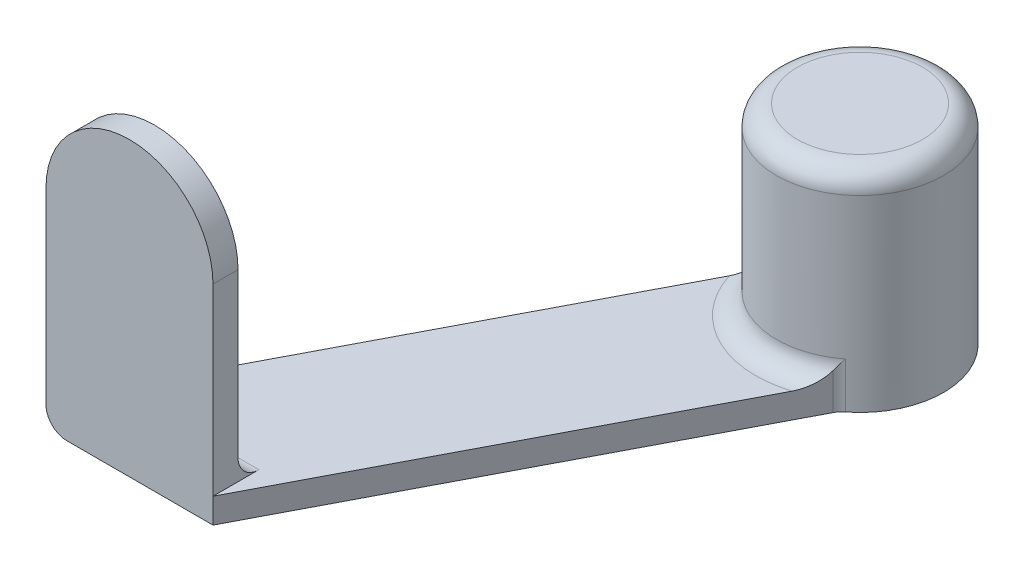
ISO-10303-21;
HEADER;
FILE_DESCRIPTION(('STEP AP214'),'2;1');
FILE_NAME('part.step','',(''),(''),'','','');
FILE_SCHEMA(('AUTOMOTIVE_DESIGN { 1 0 10303 214 1 1 1 1 }'));
ENDSEC;
DATA;
#1=APPLICATION_CONTEXT('core data for automotive mechanical design processes');
#2=APPLICATION_PROTOCOL_DEFINITION('international standard','automotive_design',2000,#1);
#3=PRODUCT_CONTEXT('',#1,'mechanical');
#4=PRODUCT('Part','Part','',(#3));
#5=PRODUCT_RELATED_PRODUCT_CATEGORY('part','',(#4));
#6=PRODUCT_DEFINITION_FORMATION('','',#4);
#7=PRODUCT_DEFINITION_CONTEXT('part definition',#1,'design');
#8=PRODUCT_DEFINITION('design','',#6,#7);
#9=PRODUCT_DEFINITION_SHAPE('','',#8);
#10=(LENGTH_UNIT() NAMED_UNIT(*) SI_UNIT(.MILLI.,.METRE.));
#11=(NAMED_UNIT(*) PLANE_ANGLE_UNIT() SI_UNIT($,.RADIAN.));
#12=(NAMED_UNIT(*) SI_UNIT($,.STERADIAN.) SOLID_ANGLE_UNIT());
#13=UNCERTAINTY_MEASURE_WITH_UNIT(LENGTH_MEASURE(1.E-05),#10,'distance_accuracy_value','');
#14=(GEOMETRIC_REPRESENTATION_CONTEXT(3) GLOBAL_UNCERTAINTY_ASSIGNED_CONTEXT((#13)) GLOBAL_UNIT_ASSIGNED_CONTEXT((#10,
#11,#12)) REPRESENTATION_CONTEXT('',''));
#15=CARTESIAN_POINT('',(0.,0.,0.));
#16=DIRECTION('',(0.,0.,1.));
#17=DIRECTION('',(1.,0.,0.));
#18=AXIS2_PLACEMENT_3D('',#15,#16,#17);
#19=CARTESIAN_POINT('',(459.323706874525,0.,110.));
#20=DIRECTION('',(0.,-1.,0.));
#21=DIRECTION('',(0.,0.,-1.));
#22=AXIS2_PLACEMENT_3D('',#19,#20,#21);
#23=PLANE('',#22);
#24=CARTESIAN_POINT('',(60.,0.,0.));
#25=DIRECTION('',(0.,-1.,0.));
#26=DIRECTION('',(0.,0.,-1.));
#27=AXIS2_PLACEMENT_3D('',#24,#25,#26);
#28=CIRCLE('',#27,15.);
#29=CARTESIAN_POINT('',(60.,0.,-15.0000000000001));
#30=VERTEX_POINT('',#29);
#31=EDGE_CURVE('E199',#30,#30,#28,.F.);
#32=ORIENTED_EDGE('',*,*,#31,.T.);
#33=EDGE_LOOP('',(#32));
#34=FACE_BOUND('',#33,.T.);
#35=ADVANCED_FACE('F37',(#34),#23,.F.);
#36=CARTESIAN_POINT('',(60.,-5.,0.));
#37=DIRECTION('',(0.,-1.,0.));
#38=DIRECTION('',(0.,0.,-1.));
#39=AXIS2_PLACEMENT_3D('',#36,#37,#38);
#40=TOROIDAL_SURFACE('',#39,15.,5.);
#41=ORIENTED_EDGE('',*,*,#31,.F.);
#42=EDGE_LOOP('',(#41));
#43=FACE_BOUND('',#42,.T.);
#44=CARTESIAN_POINT('',(60.,-5.,0.));
#45=DIRECTION('',(0.,-1.,0.));
#46=DIRECTION('',(0.,0.,-1.));
#47=AXIS2_PLACEMENT_3D('',#44,#45,#46);
#48=CIRCLE('',#47,20.);
#49=CARTESIAN_POINT('',(60.,-5.,-20.0000000000001));
#50=VERTEX_POINT('',#49);
#51=EDGE_CURVE('E196',#50,#50,#48,.T.);
#52=ORIENTED_EDGE('',*,*,#51,.F.);
#53=EDGE_LOOP('',(#52));
#54=FACE_BOUND('',#53,.T.);
#55=ADVANCED_FACE('F266',(#43,#54),#40,.T.);
#56=CARTESIAN_POINT('',(60.,-39.,0.));
#57=DIRECTION('',(0.,-1.,0.));
#58=DIRECTION('',(0.,0.,-1.));
#59=AXIS2_PLACEMENT_3D('',#56,#57,#58);
#60=TOROIDAL_SURFACE('',#59,25.,5.);
#61=CARTESIAN_POINT('',(70.9075226790226,-41.2977810602774,17.4272481985399));
#62=CARTESIAN_POINT('',(70.9509078704048,-41.2060498439026,17.3441072624428));
#63=CARTESIAN_POINT('',(70.9962333162912,-41.1134994802739,17.2629221337946));
#64=CARTESIAN_POINT('',(71.0905444477898,-40.9270140833481,17.1043907751823));
#65=CARTESIAN_POINT('',(71.1395295317539,-40.8330792796838,17.0270439176671));
#66=CARTESIAN_POINT('',(71.2916425842111,-40.5495771233536,16.8006470842951));
#67=CARTESIAN_POINT('',(71.3999488380699,-40.3582689118968,16.6572020545719));
#68=CARTESIAN_POINT('',(71.6278515517499,-39.9748426216229,16.3863276333788));
#69=CARTESIAN_POINT('',(71.7473197642914,-39.7827533449282,16.2587480472092));
#70=CARTESIAN_POINT('',(71.9976842882147,-39.3972707643174,16.0176987367564));
#71=CARTESIAN_POINT('',(72.1285754388683,-39.2038780853297,15.904222696281));
#72=CARTESIAN_POINT('',(72.267396396857,-39.007027263067,15.7959217472598));
#73=CARTESIAN_POINT('',(72.2698760628762,-39.0035136201135,15.7939909923101));
#74=CARTESIAN_POINT('',(72.2723575278799,-39.,15.792062585612));
#75=B_SPLINE_CURVE_WITH_KNOTS('',3,(#61,#62,#63,#64,#65,#66,#67,#68,#69,#70,#71,#72,#73,#74),
.UNSPECIFIED.,.F.,.F.,(4,2,2,2,2,2,4),(0.,0.39347776569895,0.786890985021447,1.57353344680736,
2.35204627452866,3.1302091837241,3.14435132214105),.UNSPECIFIED.);
#76=CARTESIAN_POINT('',(70.9075226790226,-41.2977810602774,17.4272481985399));
#77=VERTEX_POINT('',#76);
#78=CARTESIAN_POINT('',(72.2723575278799,-39.,15.792062585612));
#79=VERTEX_POINT('',#78);
#80=EDGE_CURVE('E42',#77,#79,#75,.T.);
#81=ORIENTED_EDGE('',*,*,#80,.T.);
#82=CARTESIAN_POINT('',(60.,-39.,0.));
#83=DIRECTION('',(0.,-1.,0.));
#84=DIRECTION('',(0.,0.,-1.));
#85=AXIS2_PLACEMENT_3D('',#82,#83,#84);
#86=CIRCLE('',#85,20.);
#87=CARTESIAN_POINT('',(40.0266326961491,-39.,-1.03179384833457));
#88=VERTEX_POINT('',#87);
#89=EDGE_CURVE('E190',#88,#79,#86,.F.);
#90=ORIENTED_EDGE('',*,*,#89,.F.);
#91=CARTESIAN_POINT('',(39.4662151010137,-41.2977810602773,1.02308772305691));
#92=CARTESIAN_POINT('',(39.5095887979579,-41.2060498439027,0.939940789861573));
#93=CARTESIAN_POINT('',(39.5502483735114,-41.1134994802739,0.856321294083294));
#94=CARTESIAN_POINT('',(39.6263249326898,-40.9270140833481,0.688276245564992));
#95=CARTESIAN_POINT('',(39.661742775219,-40.8330792796838,0.60385082730128));
#96=CARTESIAN_POINT('',(39.7604166635182,-40.5495771233538,0.349572690889744));
#97=CARTESIAN_POINT('',(39.8161131697168,-40.358268911898,0.1786790971685));
#98=CARTESIAN_POINT('',(39.9079112911606,-39.9748426216213,-0.163206415623165));
#99=CARTESIAN_POINT('',(39.9442094631323,-39.7827533449229,-0.33417906643354));
#100=CARTESIAN_POINT('',(39.9986951654503,-39.3972707643223,-0.677426022952912));
#101=CARTESIAN_POINT('',(40.0168908286622,-39.2038780853485,-0.849699709065943));
#102=CARTESIAN_POINT('',(40.026305472099,-39.0070272630677,-1.02551699609304));
#103=CARTESIAN_POINT('',(40.0264705617198,-39.0035136201138,-1.02865535611975));
#104=CARTESIAN_POINT('',(40.0266326961491,-39.,-1.03179384833457));
#105=B_SPLINE_CURVE_WITH_KNOTS('',3,(#91,#92,#93,#94,#95,#96,#97,#98,#99,#100,#101,#102,#103,
#104),.UNSPECIFIED.,.F.,.F.,(4,2,2,2,2,2,4),(0.,0.393477765698781,0.786890985021145,
1.57353344680769,2.35204627452887,3.13020918372401,3.14435132214095),.UNSPECIFIED.);
#106=CARTESIAN_POINT('',(39.4662151010137,-41.2977810602773,1.02308772305691));
#107=VERTEX_POINT('',#106);
#108=EDGE_CURVE('E275',#107,#88,#105,.T.);
#109=ORIENTED_EDGE('',*,*,#108,.F.);
#110=CARTESIAN_POINT('',(36.127325058713,-44.,7.42262697079987));
#111=CARTESIAN_POINT('',(36.1983313776552,-43.9999956408551,7.28653152616076));
#112=CARTESIAN_POINT('',(36.2693244817584,-43.996487374847,7.15046140996296));
#113=CARTESIAN_POINT('',(36.4111585744376,-43.9827129862363,6.87861273232785));
#114=CARTESIAN_POINT('',(36.4819995875669,-43.9724480520668,6.74283412382997));
#115=CARTESIAN_POINT('',(36.694056607901,-43.9319077475049,6.33639150152288));
#116=CARTESIAN_POINT('',(36.8348941114184,-43.8918862522785,6.0664529531146));
#117=CARTESIAN_POINT('',(37.1162762485836,-43.7869081443704,5.52713719021467));
#118=CARTESIAN_POINT('',(37.2567969807931,-43.7216573796766,5.2578057868131));
#119=CARTESIAN_POINT('',(37.5350443801921,-43.5675155773244,4.72449827129834));
#120=CARTESIAN_POINT('',(37.6727709721124,-43.4786239037293,4.46052230345118));
#121=CARTESIAN_POINT('',(37.924554665456,-43.2926851196398,3.97793689120913));
#122=CARTESIAN_POINT('',(38.0391092301934,-43.1987695546417,3.75837397546259));
#123=CARTESIAN_POINT('',(38.2649825179203,-42.9942564296783,3.32545017398592));
#124=CARTESIAN_POINT('',(38.3763016898555,-42.8836611975048,3.1120884277769));
#125=CARTESIAN_POINT('',(38.5943299254657,-42.6459459311547,2.69420097619053));
#126=CARTESIAN_POINT('',(38.701061312825,-42.5189218938219,2.48963248375193));
#127=CARTESIAN_POINT('',(38.9094187027398,-42.2467784866218,2.09028081974862));
#128=CARTESIAN_POINT('',(39.0110486109277,-42.1016732653124,1.8954901623884));
#129=CARTESIAN_POINT('',(39.1720039777722,-41.8472664837278,1.58699237593648));
#130=CARTESIAN_POINT('',(39.2333531127909,-41.7439583114357,1.46940653381727));
#131=CARTESIAN_POINT('',(39.3227797748614,-41.5820942752567,1.29800543151553));
#132=CARTESIAN_POINT('',(39.3521781828871,-41.5269426510822,1.24165848279962));
#133=CARTESIAN_POINT('',(39.4099778945258,-41.414211744272,1.13087570215881));
#134=CARTESIAN_POINT('',(39.438378869872,-41.3566316758776,1.07644049941189));
#135=CARTESIAN_POINT('',(39.4662151010137,-41.2977810602773,1.0230877230569));
#136=B_SPLINE_CURVE_WITH_KNOTS('',3,(#110,#111,#112,#113,#114,#115,#116,#117,#118,#119,#120,
#121,#122,#123,#124,#125,#126,#127,#128,#129,#130,#131,#132,#133,#134,#135),.UNSPECIFIED.,.F.,
.F.,(4,2,2,2,2,2,2,2,2,2,2,2,4),(0.,0.46042520380747,0.920769444870729,1.84089225436548,
2.77208316234223,3.70329912174847,4.49730518465676,5.2912005395171,6.08065054135098,
6.8694866314445,7.37345852418002,7.62584653107154,7.87831683790805),.UNSPECIFIED.);
#137=CARTESIAN_POINT('',(36.127325058713,-44.,7.42262697079986));
#138=VERTEX_POINT('',#137);
#139=EDGE_CURVE('E11',#138,#107,#136,.T.);
#140=ORIENTED_EDGE('',*,*,#139,.F.);
#141=CARTESIAN_POINT('',(60.,-44.,0.));
#142=DIRECTION('',(0.,-1.,0.));
#143=DIRECTION('',(0.,0.,-1.));
#144=AXIS2_PLACEMENT_3D('',#141,#142,#143);
#145=CIRCLE('',#144,25.);
#146=CARTESIAN_POINT('',(67.568632636722,-44.,23.8267874462828));
#147=VERTEX_POINT('',#146);
#148=EDGE_CURVE('E205',#147,#138,#145,.T.);
#149=ORIENTED_EDGE('',*,*,#148,.F.);
#150=CARTESIAN_POINT('',(70.9075226790226,-41.2977810602774,17.4272481985399));
#151=CARTESIAN_POINT('',(70.8723876986568,-41.372047631136,17.494590244241));
#152=CARTESIAN_POINT('',(70.8363596565238,-41.4442990005166,17.5636439916626));
#153=CARTESIAN_POINT('',(70.762768017994,-41.5849808420244,17.7046946321781));
#154=CARTESIAN_POINT('',(70.7252051277247,-41.653413037682,17.7766901718608));
#155=CARTESIAN_POINT('',(70.6488384664411,-41.7865997555289,17.9230596059878));
#156=CARTESIAN_POINT('',(70.6100373295972,-41.8513613646149,17.9974284516053));
#157=CARTESIAN_POINT('',(70.5312896443772,-41.977555076726,18.1483615149437));
#158=CARTESIAN_POINT('',(70.4913429425247,-42.0389867304058,18.2249260268275));
#159=CARTESIAN_POINT('',(70.3700246804952,-42.2185094382374,18.4574526957174));
#160=CARTESIAN_POINT('',(70.2871471986759,-42.331876026524,18.6163012025377));
#161=CARTESIAN_POINT('',(70.1181808099681,-42.5470105977815,18.940153447561));
#162=CARTESIAN_POINT('',(70.0320894630321,-42.6487695200325,19.1051618625217));
#163=CARTESIAN_POINT('',(69.8097677784512,-42.8935800018219,19.5312784246352));
#164=CARTESIAN_POINT('',(69.6717268227997,-43.029000623418,19.7958569229671));
#165=CARTESIAN_POINT('',(69.3908877015465,-43.2744207909353,20.3341319053691));
#166=CARTESIAN_POINT('',(69.2480882739406,-43.3844135306858,20.6078308082805));
#167=CARTESIAN_POINT('',(68.9586762753818,-43.5787682633448,21.1625371388514));
#168=CARTESIAN_POINT('',(68.8120607591067,-43.6631097805981,21.4435502117121));
#169=CARTESIAN_POINT('',(68.5161474067954,-43.8049111534692,22.0107174703087));
#170=CARTESIAN_POINT('',(68.3668513082687,-43.8623878125707,22.2968683258183));
#171=CARTESIAN_POINT('',(68.1091168218845,-43.9365322706474,22.7908594247213));
#172=CARTESIAN_POINT('',(68.0011009255267,-43.9601510504176,22.9978898927404));
#173=CARTESIAN_POINT('',(67.784945511072,-43.9918477988025,23.4121877704453));
#174=CARTESIAN_POINT('',(67.6768075854373,-43.9999769458228,23.6194521279119));
#175=CARTESIAN_POINT('',(67.568632636722,-44.,23.8267874462828));
#176=B_SPLINE_CURVE_WITH_KNOTS('',3,(#150,#151,#152,#153,#154,#155,#156,#157,#158,#159,#160,
#161,#162,#163,#164,#165,#166,#167,#168,#169,#170,#171,#172,#173,#174,#175),.UNSPECIFIED.,.F.,
.F.,(4,2,2,2,2,2,2,2,2,2,2,2,4),(0.,0.318613584331942,0.637082201181579,0.95491338693593,
1.27278735471745,1.90830568841894,2.54431674906336,3.52613455500781,4.50821485637313,
5.49107704160757,6.47332363888854,7.17696009410412,7.87826764573219),.UNSPECIFIED.);
#177=EDGE_CURVE('E50',#77,#147,#176,.T.);
#178=ORIENTED_EDGE('',*,*,#177,.F.);
#179=EDGE_LOOP('',(#81,#90,#109,#140,#149,#178));
#180=FACE_BOUND('',#179,.T.);
#181=ADVANCED_FACE('F228',(#180),#60,.F.);
#182=CARTESIAN_POINT('',(75.3404469098499,56.5685424949237,19.740078232015));
#183=DIRECTION('',(0.,-1.,0.));
#184=DIRECTION('',(0.,0.,-1.));
#185=AXIS2_PLACEMENT_3D('',#182,#183,#184);
#186=CYLINDRICAL_SURFACE('',#185,5.);
#187=CARTESIAN_POINT('',(75.3404469098499,-50.,19.740078232015));
#188=DIRECTION('',(0.,-1.,0.));
#189=DIRECTION('',(0.,0.,-1.));
#190=AXIS2_PLACEMENT_3D('',#187,#188,#189);
#191=CIRCLE('',#190,5.);
#192=CARTESIAN_POINT('',(72.2723575278799,-50.,15.792062585612));
#193=VERTEX_POINT('',#192);
#194=CARTESIAN_POINT('',(70.9075226790226,-50.,17.4272481985399));
#195=VERTEX_POINT('',#194);
#196=EDGE_CURVE('E218',#193,#195,#191,.F.);
#197=ORIENTED_EDGE('',*,*,#196,.F.);
#198=DIRECTION('',(0.,-1.,0.));
#199=VECTOR('',#198,1.);
#200=CARTESIAN_POINT('',(72.2723575278799,56.5685424949237,15.792062585612));
#201=LINE('',#200,#199);
#202=EDGE_CURVE('E192',#79,#193,#201,.T.);
#203=ORIENTED_EDGE('',*,*,#202,.F.);
#204=ORIENTED_EDGE('',*,*,#80,.F.);
#205=DIRECTION('',(0.,-1.,0.));
#206=VECTOR('',#205,1.);
#207=CARTESIAN_POINT('',(70.9075226790226,-44.,17.4272481985399));
#208=LINE('',#207,#206);
#209=EDGE_CURVE('E58',#195,#77,#208,.F.);
#210=ORIENTED_EDGE('',*,*,#209,.F.);
#211=EDGE_LOOP('',(#197,#203,#204,#210));
#212=FACE_BOUND('',#211,.T.);
#213=ADVANCED_FACE('F39',(#212),#186,.F.);
#214=CARTESIAN_POINT('',(60.,56.5685424949237,0.));
#215=DIRECTION('',(0.,-1.,0.));
#216=DIRECTION('',(0.,0.,-1.));
#217=AXIS2_PLACEMENT_3D('',#214,#215,#216);
#218=CYLINDRICAL_SURFACE('',#217,20.);
#219=ORIENTED_EDGE('',*,*,#51,.T.);
#220=EDGE_LOOP('',(#219));
#221=FACE_BOUND('',#220,.T.);
#222=CARTESIAN_POINT('',(60.,-50.,0.));
#223=DIRECTION('',(0.,-1.,0.));
#224=DIRECTION('',(0.,0.,-1.));
#225=AXIS2_PLACEMENT_3D('',#222,#223,#224);
#226=CIRCLE('',#225,20.);
#227=CARTESIAN_POINT('',(40.0266326961491,-50.,-1.03179384833457));
#228=VERTEX_POINT('',#227);
#229=EDGE_CURVE('E282',#193,#228,#226,.F.);
#230=ORIENTED_EDGE('',*,*,#229,.T.);
#231=DIRECTION('',(0.,-1.,0.));
#232=VECTOR('',#231,1.);
#233=CARTESIAN_POINT('',(40.0266326961491,56.5685424949237,-1.03179384833457));
#234=LINE('',#233,#232);
#235=EDGE_CURVE('E194',#228,#88,#234,.F.);
#236=ORIENTED_EDGE('',*,*,#235,.T.);
#237=ORIENTED_EDGE('',*,*,#89,.T.);
#238=ORIENTED_EDGE('',*,*,#202,.T.);
#239=EDGE_LOOP('',(#230,#236,#237,#238));
#240=FACE_BOUND('',#239,.T.);
#241=ADVANCED_FACE('F274',(#221,#240),#218,.T.);
#242=CARTESIAN_POINT('',(35.0332908701864,56.5685424949237,-1.28974231041819));
#243=DIRECTION('',(0.,-1.,0.));
#244=DIRECTION('',(0.,0.,-1.));
#245=AXIS2_PLACEMENT_3D('',#242,#243,#244);
#246=CYLINDRICAL_SURFACE('',#245,5.);
#247=ORIENTED_EDGE('',*,*,#108,.T.);
#248=ORIENTED_EDGE('',*,*,#235,.F.);
#249=CARTESIAN_POINT('',(35.0332908701864,-50.,-1.28974231041819));
#250=DIRECTION('',(0.,-1.,0.));
#251=DIRECTION('',(0.,0.,-1.));
#252=AXIS2_PLACEMENT_3D('',#249,#250,#251);
#253=CIRCLE('',#252,5.);
#254=CARTESIAN_POINT('',(39.4662151010137,-50.,1.02308772305688));
#255=VERTEX_POINT('',#254);
#256=EDGE_CURVE('E216',#255,#228,#253,.F.);
#257=ORIENTED_EDGE('',*,*,#256,.F.);
#258=DIRECTION('',(0.,-1.,0.));
#259=VECTOR('',#258,1.);
#260=CARTESIAN_POINT('',(39.4662151010137,-44.,1.02308772305691));
#261=LINE('',#260,#259);
#262=EDGE_CURVE('E66',#107,#255,#261,.T.);
#263=ORIENTED_EDGE('',*,*,#262,.F.);
#264=EDGE_LOOP('',(#247,#248,#257,#263));
#265=FACE_BOUND('',#264,.T.);
#266=ADVANCED_FACE('F243',(#265),#246,.F.);
#267=CARTESIAN_POINT('',(-20.,-44.,115.));
#268=DIRECTION('',(-0.886584846165455,0.,-0.46256600669502));
#269=DIRECTION('',(-0.46256600669502,0.,0.886584846165455));
#270=AXIS2_PLACEMENT_3D('',#267,#268,#269);
#271=PLANE('',#270);
#272=DIRECTION('',(0.46256600669502,0.,-0.886584846165455));
#273=VECTOR('',#272,1.);
#274=CARTESIAN_POINT('',(-20.,-44.,115.));
#275=LINE('',#274,#273);
#276=CARTESIAN_POINT('',(-14.2608695652174,-44.,104.));
#277=VERTEX_POINT('',#276);
#278=EDGE_CURVE('E295',#277,#138,#275,.T.);
#279=ORIENTED_EDGE('',*,*,#278,.T.);
#280=ORIENTED_EDGE('',*,*,#139,.T.);
#281=ORIENTED_EDGE('',*,*,#262,.T.);
#282=DIRECTION('',(0.46256600669502,0.,-0.886584846165455));
#283=VECTOR('',#282,1.);
#284=CARTESIAN_POINT('',(-20.,-50.,115.));
#285=LINE('',#284,#283);
#286=CARTESIAN_POINT('',(-15.,-50.,105.416666666667));
#287=VERTEX_POINT('',#286);
#288=EDGE_CURVE('E287',#287,#255,#285,.T.);
#289=ORIENTED_EDGE('',*,*,#288,.F.);
#290=CARTESIAN_POINT('',(-15.,-45.,105.416666666667));
#291=DIRECTION('',(-0.886584846165455,0.,-0.46256600669502));
#292=DIRECTION('',(-0.46256600669502,0.,0.886584846165455));
#293=AXIS2_PLACEMENT_3D('',#290,#291,#292);
#294=ELLIPSE('',#293,10.8092681425607,5.);
#295=CARTESIAN_POINT('',(-16.8695652173913,-49.6373188264255,109.));
#296=VERTEX_POINT('',#295);
#297=EDGE_CURVE('E183',#287,#296,#294,.T.);
#298=ORIENTED_EDGE('',*,*,#297,.T.);
#299=DIRECTION('',(0.,1.,0.));
#300=VECTOR('',#299,1.);
#301=CARTESIAN_POINT('',(-16.8695652173913,0.,109.));
#302=LINE('',#301,#300);
#303=CARTESIAN_POINT('',(-16.8695652173913,-39.,109.));
#304=VERTEX_POINT('',#303);
#305=EDGE_CURVE('E164',#296,#304,#302,.T.);
#306=ORIENTED_EDGE('',*,*,#305,.T.);
#307=CARTESIAN_POINT('',(-14.2608695652174,-39.,104.));
#308=DIRECTION('',(-0.886584846165455,0.,-0.46256600669502));
#309=DIRECTION('',(-0.46256600669502,0.,0.886584846165455));
#310=AXIS2_PLACEMENT_3D('',#307,#308,#309);
#311=ELLIPSE('',#310,5.63961816133602,5.);
#312=EDGE_CURVE('E212',#304,#277,#311,.F.);
#313=ORIENTED_EDGE('',*,*,#312,.T.);
#314=EDGE_LOOP('',(#279,#280,#281,#289,#298,#306,#313));
#315=FACE_BOUND('',#314,.T.);
#316=ADVANCED_FACE('F238',(#315),#271,.T.);
#317=CARTESIAN_POINT('',(0.,-39.,104.));
#318=DIRECTION('',(-1.,0.,0.));
#319=DIRECTION('',(0.,0.,1.));
#320=AXIS2_PLACEMENT_3D('',#317,#318,#319);
#321=CYLINDRICAL_SURFACE('',#320,5.);
#322=CARTESIAN_POINT('',(20.,-39.,104.));
#323=DIRECTION('',(-1.,0.,0.));
#324=DIRECTION('',(0.,0.,1.));
#325=AXIS2_PLACEMENT_3D('',#322,#323,#324);
#326=CIRCLE('',#325,5.);
#327=CARTESIAN_POINT('',(20.,-44.,104.));
#328=VERTEX_POINT('',#327);
#329=CARTESIAN_POINT('',(20.,-39.,109.));
#330=VERTEX_POINT('',#329);
#331=EDGE_CURVE('E214',#328,#330,#326,.T.);
#332=ORIENTED_EDGE('',*,*,#331,.F.);
#333=DIRECTION('',(-1.,0.,0.));
#334=VECTOR('',#333,1.);
#335=CARTESIAN_POINT('',(459.323706874525,-44.,104.));
#336=LINE('',#335,#334);
#337=EDGE_CURVE('E207',#277,#328,#336,.F.);
#338=ORIENTED_EDGE('',*,*,#337,.F.);
#339=ORIENTED_EDGE('',*,*,#312,.F.);
#340=DIRECTION('',(-1.,0.,0.));
#341=VECTOR('',#340,1.);
#342=CARTESIAN_POINT('',(0.,-39.,109.));
#343=LINE('',#342,#341);
#344=EDGE_CURVE('E202',#330,#304,#343,.T.);
#345=ORIENTED_EDGE('',*,*,#344,.F.);
#346=EDGE_LOOP('',(#332,#338,#339,#345));
#347=FACE_BOUND('',#346,.T.);
#348=ADVANCED_FACE('F242',(#347),#321,.F.);
#349=CARTESIAN_POINT('',(459.323706874525,-44.,110.));
#350=DIRECTION('',(0.,-1.,0.));
#351=DIRECTION('',(0.,0.,-1.));
#352=AXIS2_PLACEMENT_3D('',#349,#350,#351);
#353=PLANE('',#352);
#354=ORIENTED_EDGE('',*,*,#278,.F.);
#355=ORIENTED_EDGE('',*,*,#337,.T.);
#356=DIRECTION('',(0.,0.,1.));
#357=VECTOR('',#356,1.);
#358=CARTESIAN_POINT('',(20.,-44.,115.));
#359=LINE('',#358,#357);
#360=CARTESIAN_POINT('',(20.,-44.,115.));
#361=VERTEX_POINT('',#360);
#362=EDGE_CURVE('E176',#328,#361,#359,.T.);
#363=ORIENTED_EDGE('',*,*,#362,.T.);
#364=DIRECTION('',(-0.46256600669502,0.,0.886584846165455));
#365=VECTOR('',#364,1.);
#366=CARTESIAN_POINT('',(80.,-44.,0.));
#367=LINE('',#366,#365);
#368=EDGE_CURVE('E167',#147,#361,#367,.T.);
#369=ORIENTED_EDGE('',*,*,#368,.F.);
#370=ORIENTED_EDGE('',*,*,#148,.T.);
#371=EDGE_LOOP('',(#354,#355,#363,#369,#370));
#372=FACE_BOUND('',#371,.T.);
#373=ADVANCED_FACE('F236',(#372),#353,.F.);
#374=CARTESIAN_POINT('',(80.,-44.,0.));
#375=DIRECTION('',(0.886584846165455,0.,0.46256600669502));
#376=DIRECTION('',(0.46256600669502,0.,-0.886584846165455));
#377=AXIS2_PLACEMENT_3D('',#374,#375,#376);
#378=PLANE('',#377);
#379=DIRECTION('',(-0.46256600669502,0.,0.886584846165455));
#380=VECTOR('',#379,1.);
#381=CARTESIAN_POINT('',(80.,-50.,0.));
#382=LINE('',#381,#380);
#383=CARTESIAN_POINT('',(20.,-50.,115.));
#384=VERTEX_POINT('',#383);
#385=EDGE_CURVE('E292',#195,#384,#382,.T.);
#386=ORIENTED_EDGE('',*,*,#385,.F.);
#387=ORIENTED_EDGE('',*,*,#209,.T.);
#388=ORIENTED_EDGE('',*,*,#177,.T.);
#389=ORIENTED_EDGE('',*,*,#368,.T.);
#390=DIRECTION('',(0.,1.,0.));
#391=VECTOR('',#390,1.);
#392=CARTESIAN_POINT('',(20.,-50.,115.));
#393=LINE('',#392,#391);
#394=EDGE_CURVE('E171',#384,#361,#393,.T.);
#395=ORIENTED_EDGE('',*,*,#394,.F.);
#396=EDGE_LOOP('',(#386,#387,#388,#389,#395));
#397=FACE_BOUND('',#396,.T.);
#398=ADVANCED_FACE('F231',(#397),#378,.T.);
#399=CARTESIAN_POINT('',(459.323706874525,-50.,110.));
#400=DIRECTION('',(0.,-1.,0.));
#401=DIRECTION('',(0.,0.,-1.));
#402=AXIS2_PLACEMENT_3D('',#399,#400,#401);
#403=PLANE('',#402);
#404=DIRECTION('',(-1.,0.,0.));
#405=VECTOR('',#404,1.);
#406=CARTESIAN_POINT('',(-20.,-50.,115.));
#407=LINE('',#406,#405);
#408=CARTESIAN_POINT('',(-15.,-50.,115.));
#409=VERTEX_POINT('',#408);
#410=EDGE_CURVE('E158',#384,#409,#407,.T.);
#411=ORIENTED_EDGE('',*,*,#410,.T.);
#412=DIRECTION('',(0.,0.,-1.));
#413=VECTOR('',#412,1.);
#414=CARTESIAN_POINT('',(-15.,-50.,109.));
#415=LINE('',#414,#413);
#416=EDGE_CURVE('E180',#409,#287,#415,.T.);
#417=ORIENTED_EDGE('',*,*,#416,.T.);
#418=ORIENTED_EDGE('',*,*,#288,.T.);
#419=ORIENTED_EDGE('',*,*,#256,.T.);
#420=ORIENTED_EDGE('',*,*,#229,.F.);
#421=ORIENTED_EDGE('',*,*,#196,.T.);
#422=ORIENTED_EDGE('',*,*,#385,.T.);
#423=EDGE_LOOP('',(#411,#417,#418,#419,#420,#421,#422));
#424=FACE_BOUND('',#423,.T.);
#425=ADVANCED_FACE('F235',(#424),#403,.T.);
#426=CARTESIAN_POINT('',(-15.,-45.,110.));
#427=DIRECTION('',(0.,0.,1.));
#428=DIRECTION('',(1.,0.,0.));
#429=AXIS2_PLACEMENT_3D('',#426,#427,#428);
#430=CYLINDRICAL_SURFACE('',#429,5.);
#431=CARTESIAN_POINT('',(-15.,-45.,115.));
#432=DIRECTION('',(0.,0.,-1.));
#433=DIRECTION('',(-1.,0.,0.));
#434=AXIS2_PLACEMENT_3D('',#431,#432,#433);
#435=CIRCLE('',#434,5.);
#436=CARTESIAN_POINT('',(-20.,-45.,115.));
#437=VERTEX_POINT('',#436);
#438=EDGE_CURVE('E188',#437,#409,#435,.F.);
#439=ORIENTED_EDGE('',*,*,#438,.F.);
#440=DIRECTION('',(0.,0.,-1.));
#441=VECTOR('',#440,1.);
#442=CARTESIAN_POINT('',(-20.,-45.,115.));
#443=LINE('',#442,#441);
#444=CARTESIAN_POINT('',(-20.,-45.,109.));
#445=VERTEX_POINT('',#444);
#446=EDGE_CURVE('E157',#445,#437,#443,.F.);
#447=ORIENTED_EDGE('',*,*,#446,.F.);
#448=CARTESIAN_POINT('',(-15.,-45.,109.));
#449=DIRECTION('',(0.,0.,-1.));
#450=DIRECTION('',(-1.,0.,0.));
#451=AXIS2_PLACEMENT_3D('',#448,#449,#450);
#452=CIRCLE('',#451,5.);
#453=EDGE_CURVE('E185',#296,#445,#452,.T.);
#454=ORIENTED_EDGE('',*,*,#453,.F.);
#455=ORIENTED_EDGE('',*,*,#297,.F.);
#456=ORIENTED_EDGE('',*,*,#416,.F.);
#457=EDGE_LOOP('',(#439,#447,#454,#455,#456));
#458=FACE_BOUND('',#457,.T.);
#459=ADVANCED_FACE('F247',(#458),#430,.T.);
#460=CARTESIAN_POINT('',(-20.,-50.,115.));
#461=DIRECTION('',(1.,0.,0.));
#462=DIRECTION('',(0.,0.,-1.));
#463=AXIS2_PLACEMENT_3D('',#460,#461,#462);
#464=PLANE('',#463);
#465=DIRECTION('',(0.,1.,0.));
#466=VECTOR('',#465,1.);
#467=CARTESIAN_POINT('',(-20.,-50.,109.));
#468=LINE('',#467,#466);
#469=CARTESIAN_POINT('',(-20.,0.,109.));
#470=VERTEX_POINT('',#469);
#471=EDGE_CURVE('E149',#445,#470,#468,.T.);
#472=ORIENTED_EDGE('',*,*,#471,.F.);
#473=ORIENTED_EDGE('',*,*,#446,.T.);
#474=DIRECTION('',(0.,1.,0.));
#475=VECTOR('',#474,1.);
#476=CARTESIAN_POINT('',(-20.,-50.,115.));
#477=LINE('',#476,#475);
#478=CARTESIAN_POINT('',(-20.,0.,115.));
#479=VERTEX_POINT('',#478);
#480=EDGE_CURVE('E139',#437,#479,#477,.T.);
#481=ORIENTED_EDGE('',*,*,#480,.T.);
#482=DIRECTION('',(0.,0.,-1.));
#483=VECTOR('',#482,1.);
#484=CARTESIAN_POINT('',(-20.,0.,115.));
#485=LINE('',#484,#483);
#486=EDGE_CURVE('E155',#479,#470,#485,.T.);
#487=ORIENTED_EDGE('',*,*,#486,.T.);
#488=EDGE_LOOP('',(#472,#473,#481,#487));
#489=FACE_BOUND('',#488,.T.);
#490=ADVANCED_FACE('F154',(#489),#464,.F.);
#491=CARTESIAN_POINT('',(0.,0.,109.));
#492=DIRECTION('',(0.,0.,-1.));
#493=DIRECTION('',(-1.,0.,0.));
#494=AXIS2_PLACEMENT_3D('',#491,#492,#493);
#495=PLANE('',#494);
#496=DIRECTION('',(0.,1.,0.));
#497=VECTOR('',#496,1.);
#498=CARTESIAN_POINT('',(20.,-50.,109.));
#499=LINE('',#498,#497);
#500=CARTESIAN_POINT('',(20.,0.,109.));
#501=VERTEX_POINT('',#500);
#502=EDGE_CURVE('E173',#330,#501,#499,.T.);
#503=ORIENTED_EDGE('',*,*,#502,.F.);
#504=ORIENTED_EDGE('',*,*,#344,.T.);
#505=ORIENTED_EDGE('',*,*,#305,.F.);
#506=ORIENTED_EDGE('',*,*,#453,.T.);
#507=ORIENTED_EDGE('',*,*,#471,.T.);
#508=CARTESIAN_POINT('',(0.,0.,109.));
#509=DIRECTION('',(0.,0.,-1.));
#510=DIRECTION('',(-1.,0.,0.));
#511=AXIS2_PLACEMENT_3D('',#508,#509,#510);
#512=CIRCLE('',#511,20.);
#513=EDGE_CURVE('E148',#470,#501,#512,.T.);
#514=ORIENTED_EDGE('',*,*,#513,.T.);
#515=EDGE_LOOP('',(#503,#504,#505,#506,#507,#514));
#516=FACE_BOUND('',#515,.T.);
#517=ADVANCED_FACE('F255',(#516),#495,.T.);
#518=CARTESIAN_POINT('',(0.,0.,115.));
#519=DIRECTION('',(0.,0.,-1.));
#520=DIRECTION('',(-1.,0.,0.));
#521=AXIS2_PLACEMENT_3D('',#518,#519,#520);
#522=PLANE('',#521);
#523=CARTESIAN_POINT('',(20.,0.,115.));
#524=VERTEX_POINT('',#523);
#525=EDGE_CURVE('E143',#361,#524,#393,.T.);
#526=ORIENTED_EDGE('',*,*,#525,.T.);
#527=CARTESIAN_POINT('',(0.,0.,115.));
#528=DIRECTION('',(0.,0.,-1.));
#529=DIRECTION('',(-1.,0.,0.));
#530=AXIS2_PLACEMENT_3D('',#527,#528,#529);
#531=CIRCLE('',#530,20.);
#532=EDGE_CURVE('E136',#479,#524,#531,.T.);
#533=ORIENTED_EDGE('',*,*,#532,.F.);
#534=ORIENTED_EDGE('',*,*,#480,.F.);
#535=ORIENTED_EDGE('',*,*,#438,.T.);
#536=ORIENTED_EDGE('',*,*,#410,.F.);
#537=ORIENTED_EDGE('',*,*,#394,.T.);
#538=EDGE_LOOP('',(#526,#533,#534,#535,#536,#537));
#539=FACE_BOUND('',#538,.T.);
#540=ADVANCED_FACE('F138',(#539),#522,.F.);
#541=CARTESIAN_POINT('',(20.,-50.,115.));
#542=DIRECTION('',(-1.,0.,0.));
#543=DIRECTION('',(0.,0.,1.));
#544=AXIS2_PLACEMENT_3D('',#541,#542,#543);
#545=PLANE('',#544);
#546=ORIENTED_EDGE('',*,*,#362,.F.);
#547=ORIENTED_EDGE('',*,*,#331,.T.);
#548=ORIENTED_EDGE('',*,*,#502,.T.);
#549=DIRECTION('',(0.,0.,1.));
#550=VECTOR('',#549,1.);
#551=CARTESIAN_POINT('',(20.,0.,115.));
#552=LINE('',#551,#550);
#553=EDGE_CURVE('E163',#501,#524,#552,.T.);
#554=ORIENTED_EDGE('',*,*,#553,.T.);
#555=ORIENTED_EDGE('',*,*,#525,.F.);
#556=EDGE_LOOP('',(#546,#547,#548,#554,#555));
#557=FACE_BOUND('',#556,.T.);
#558=ADVANCED_FACE('F249',(#557),#545,.F.);
#559=CARTESIAN_POINT('',(0.,0.,109.));
#560=DIRECTION('',(0.,0.,1.));
#561=DIRECTION('',(1.,0.,0.));
#562=AXIS2_PLACEMENT_3D('',#559,#560,#561);
#563=CYLINDRICAL_SURFACE('',#562,20.);
#564=ORIENTED_EDGE('',*,*,#553,.F.);
#565=ORIENTED_EDGE('',*,*,#513,.F.);
#566=ORIENTED_EDGE('',*,*,#486,.F.);
#567=ORIENTED_EDGE('',*,*,#532,.T.);
#568=EDGE_LOOP('',(#564,#565,#566,#567));
#569=FACE_BOUND('',#568,.T.);
#570=ADVANCED_FACE('F161',(#569),#563,.T.);
#571=CLOSED_SHELL('',(#35,#55,#181,#213,#241,#266,#316,#348,#373,#398,#425,#459,#490,#517,#540,
#558,#570));
#572=MANIFOLD_SOLID_BREP('B2',#571);
#573=ADVANCED_BREP_SHAPE_REPRESENTATION('',(#18,#572),#14);
#574=SHAPE_DEFINITION_REPRESENTATION(#9,#573);
ENDSEC;
END-ISO-10303-21;
